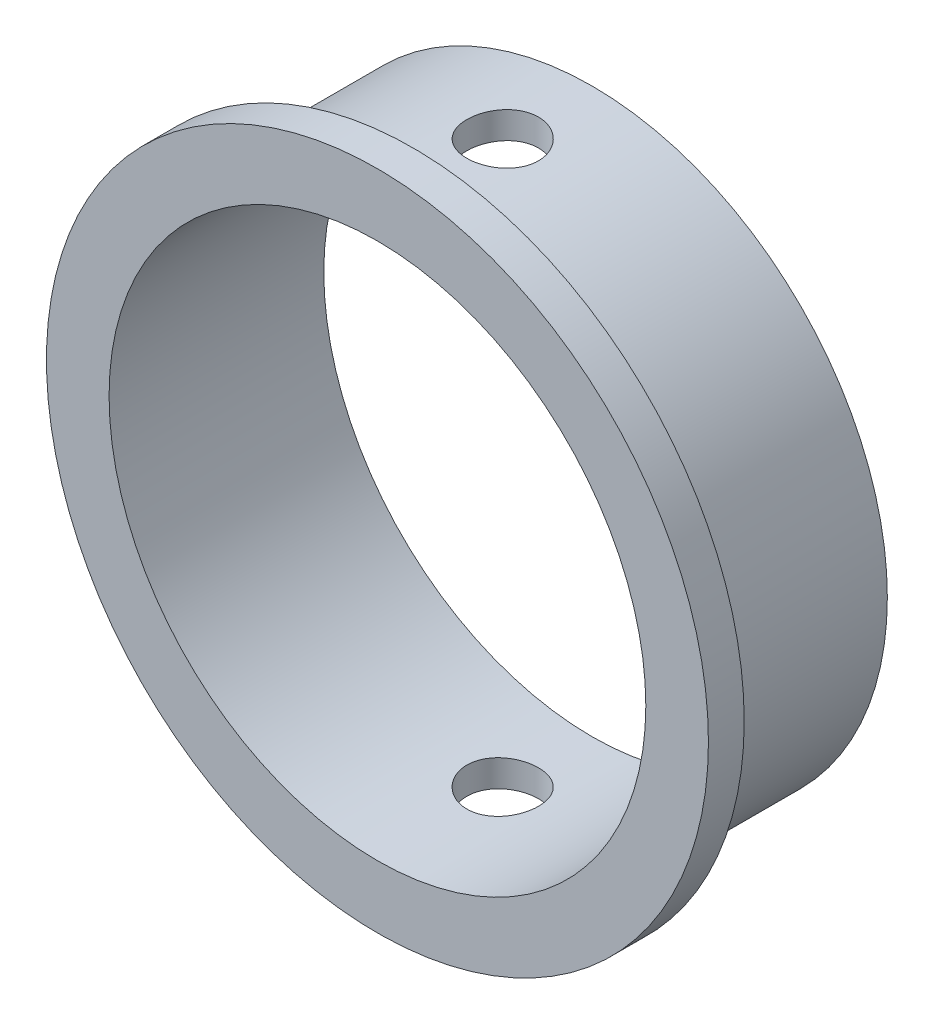
ISO-10303-21;
HEADER;
FILE_DESCRIPTION(('STEP AP214'),'2;1');
FILE_NAME('part.step','',(''),(''),'','','');
FILE_SCHEMA(('AUTOMOTIVE_DESIGN { 1 0 10303 214 1 1 1 1 }'));
ENDSEC;
DATA;
#1=APPLICATION_CONTEXT('core data for automotive mechanical design processes');
#2=APPLICATION_PROTOCOL_DEFINITION('international standard','automotive_design',2000,#1);
#3=PRODUCT_CONTEXT('',#1,'mechanical');
#4=PRODUCT('Part','Part','',(#3));
#5=PRODUCT_RELATED_PRODUCT_CATEGORY('part','',(#4));
#6=PRODUCT_DEFINITION_FORMATION('','',#4);
#7=PRODUCT_DEFINITION_CONTEXT('part definition',#1,'design');
#8=PRODUCT_DEFINITION('design','',#6,#7);
#9=PRODUCT_DEFINITION_SHAPE('','',#8);
#10=(LENGTH_UNIT() NAMED_UNIT(*) SI_UNIT(.MILLI.,.METRE.));
#11=(NAMED_UNIT(*) PLANE_ANGLE_UNIT() SI_UNIT($,.RADIAN.));
#12=(NAMED_UNIT(*) SI_UNIT($,.STERADIAN.) SOLID_ANGLE_UNIT());
#13=UNCERTAINTY_MEASURE_WITH_UNIT(LENGTH_MEASURE(1.E-05),#10,'distance_accuracy_value','');
#14=(GEOMETRIC_REPRESENTATION_CONTEXT(3) GLOBAL_UNCERTAINTY_ASSIGNED_CONTEXT((#13)) GLOBAL_UNIT_ASSIGNED_CONTEXT((#10,
#11,#12)) REPRESENTATION_CONTEXT('',''));
#15=CARTESIAN_POINT('',(0.,0.,0.));
#16=DIRECTION('',(0.,0.,1.));
#17=DIRECTION('',(1.,0.,0.));
#18=AXIS2_PLACEMENT_3D('',#15,#16,#17);
#19=CARTESIAN_POINT('',(0.,0.,12.));
#20=DIRECTION('',(0.,0.,-1.));
#21=DIRECTION('',(-1.,0.,0.));
#22=AXIS2_PLACEMENT_3D('',#19,#20,#21);
#23=CYLINDRICAL_SURFACE('',#22,16.5);
#24=CARTESIAN_POINT('',(0.,0.,0.));
#25=DIRECTION('',(0.,0.,1.));
#26=DIRECTION('',(1.,0.,0.));
#27=AXIS2_PLACEMENT_3D('',#24,#25,#26);
#28=CIRCLE('',#27,16.5);
#29=CARTESIAN_POINT('',(16.5,0.,0.));
#30=VERTEX_POINT('',#29);
#31=EDGE_CURVE('E51',#30,#30,#28,.T.);
#32=ORIENTED_EDGE('',*,*,#31,.T.);
#33=EDGE_LOOP('',(#32));
#34=FACE_BOUND('',#33,.T.);
#35=CARTESIAN_POINT('',(0.,0.,10.));
#36=DIRECTION('',(0.,0.,1.));
#37=DIRECTION('',(1.,0.,0.));
#38=AXIS2_PLACEMENT_3D('',#35,#36,#37);
#39=CIRCLE('',#38,16.5);
#40=CARTESIAN_POINT('',(16.5,0.,10.));
#41=VERTEX_POINT('',#40);
#42=EDGE_CURVE('E10',#41,#41,#39,.T.);
#43=ORIENTED_EDGE('',*,*,#42,.F.);
#44=EDGE_LOOP('',(#43));
#45=FACE_BOUND('',#44,.T.);
#46=CARTESIAN_POINT('',(0.,-16.5,3.));
#47=CARTESIAN_POINT('',(0.111900652745753,-16.4999984779065,3.00000477050452));
#48=CARTESIAN_POINT('',(0.223871904032017,-16.4988496240957,3.00942297400346));
#49=CARTESIAN_POINT('',(0.444700533689577,-16.4943771196932,3.04684643983153));
#50=CARTESIAN_POINT('',(0.553554504762757,-16.4910511775677,3.07487128736526));
#51=CARTESIAN_POINT('',(0.764919510268094,-16.4825993069214,3.1486718701649));
#52=CARTESIAN_POINT('',(0.867434690019245,-16.4774745697025,3.19443585927991));
#53=CARTESIAN_POINT('',(1.06330969859502,-16.4659955890597,3.30239042175111));
#54=CARTESIAN_POINT('',(1.15667113512243,-16.4596415621251,3.36457810344653));
#55=CARTESIAN_POINT('',(1.33209299868107,-16.4463769355912,3.50396004191844));
#56=CARTESIAN_POINT('',(1.41409908717695,-16.4394638947195,3.58122246201803));
#57=CARTESIAN_POINT('',(1.56401456556999,-16.4258801485878,3.74841444068733));
#58=CARTESIAN_POINT('',(1.63192324849505,-16.4192094554952,3.83834463415494));
#59=CARTESIAN_POINT('',(1.75191716988259,-16.4068415428533,4.02867056915003));
#60=CARTESIAN_POINT('',(1.80395175863557,-16.4011474641863,4.12909846523849));
#61=CARTESIAN_POINT('',(1.890396973409,-16.3914094269994,4.33734767326114));
#62=CARTESIAN_POINT('',(1.92480822874977,-16.3873654095577,4.4451687210337));
#63=CARTESIAN_POINT('',(1.97486543894206,-16.3814085259354,4.6645809803213));
#64=CARTESIAN_POINT('',(1.99060291820116,-16.3794852687384,4.77615102425448));
#65=CARTESIAN_POINT('',(2.00314900757413,-16.3779558032128,5.00036395290491));
#66=CARTESIAN_POINT('',(1.99995833501188,-16.378349507078,5.11300679680453));
#67=CARTESIAN_POINT('',(1.97481387160751,-16.3813999724305,5.33553111433497));
#68=CARTESIAN_POINT('',(1.95296075085867,-16.3840445916395,5.44542415339718));
#69=CARTESIAN_POINT('',(1.89126871983955,-16.3912799650409,5.65997160226844));
#70=CARTESIAN_POINT('',(1.85142946508204,-16.3958707565081,5.7646259116978));
#71=CARTESIAN_POINT('',(1.7547873702743,-16.4064950132083,5.96603876495957));
#72=CARTESIAN_POINT('',(1.69794063194365,-16.4125322036319,6.06277604097104));
#73=CARTESIAN_POINT('',(1.56892866589002,-16.4253661000015,6.24537581516183));
#74=CARTESIAN_POINT('',(1.49676277915695,-16.4321628386163,6.33123784524823));
#75=CARTESIAN_POINT('',(1.33860240327758,-16.4458040138629,6.49023425293448));
#76=CARTESIAN_POINT('',(1.25252111354027,-16.4526484734842,6.56328231212309));
#77=CARTESIAN_POINT('',(1.06927274722926,-16.4655725184432,6.6939056265894));
#78=CARTESIAN_POINT('',(0.972105647621771,-16.4716521021916,6.75148084971724));
#79=CARTESIAN_POINT('',(0.769378430470085,-16.4823648486936,6.84952362215943));
#80=CARTESIAN_POINT('',(0.663815756382462,-16.4869975687294,6.8899859365276));
#81=CARTESIAN_POINT('',(0.44732591244609,-16.4942905230712,6.95258666420573));
#82=CARTESIAN_POINT('',(0.336398978895798,-16.4969508441783,6.97472588388087));
#83=CARTESIAN_POINT('',(0.113075966743468,-16.4999879955856,6.99994048832598));
#84=CARTESIAN_POINT('',(0.000693503454519923,-16.5003790725291,7.00313481468463));
#85=CARTESIAN_POINT('',(-0.223005145792385,-16.4988720937279,6.99068259898083));
#86=CARTESIAN_POINT('',(-0.334321353028406,-16.4969740837604,6.97503643368959));
#87=CARTESIAN_POINT('',(-0.552377941153377,-16.4911111050895,6.92544616148108));
#88=CARTESIAN_POINT('',(-0.659131367635968,-16.48715252492,6.89155859866223));
#89=CARTESIAN_POINT('',(-0.865439758869918,-16.4776117375988,6.80650614932307));
#90=CARTESIAN_POINT('',(-0.964994492436562,-16.4720294783319,6.75534070822576));
#91=CARTESIAN_POINT('',(-1.15461179660808,-16.4598284940776,6.63689593947882));
#92=CARTESIAN_POINT('',(-1.24462586098187,-16.4532048615695,6.56953947269468));
#93=CARTESIAN_POINT('',(-1.41211356712873,-16.4396778886325,6.42073402837308));
#94=CARTESIAN_POINT('',(-1.48958674165607,-16.4327745377939,6.3392845259942));
#95=CARTESIAN_POINT('',(-1.63021400638046,-16.4194223992092,6.16408193573002));
#96=CARTESIAN_POINT('',(-1.69328937988266,-16.4129762372037,6.07026543637535));
#97=CARTESIAN_POINT('',(-1.80278720242417,-16.4013110252712,5.87330049527574));
#98=CARTESIAN_POINT('',(-1.84920996836413,-16.3960919519932,5.77015223116192));
#99=CARTESIAN_POINT('',(-1.9239566420472,-16.3874895132632,5.55770838322316));
#100=CARTESIAN_POINT('',(-1.95232533568764,-16.384101608491,5.44842874857452));
#101=CARTESIAN_POINT('',(-1.99030299852835,-16.3795319177777,5.22661333777482));
#102=CARTESIAN_POINT('',(-1.99991278426896,-16.3783500358125,5.11407770356775));
#103=CARTESIAN_POINT('',(-2.00008547152799,-16.3783288857002,4.88972774951011));
#104=CARTESIAN_POINT('',(-1.99077203440856,-16.3794744081966,4.77791350606227));
#105=CARTESIAN_POINT('',(-1.9536240895631,-16.38394634175,4.55745184452547));
#106=CARTESIAN_POINT('',(-1.92578957627467,-16.387272753462,4.44880442738761));
#107=CARTESIAN_POINT('',(-1.85242753726192,-16.3957270398671,4.23777429834076));
#108=CARTESIAN_POINT('',(-1.80690559263951,-16.400854346256,4.13538962206649));
#109=CARTESIAN_POINT('',(-1.69947310215269,-16.4123336803137,3.93969260079986));
#110=CARTESIAN_POINT('',(-1.63756239952019,-16.4186857196976,3.84638034260218));
#111=CARTESIAN_POINT('',(-1.49864990949873,-16.4319485568618,3.67084442679896));
#112=CARTESIAN_POINT('',(-1.42155592172374,-16.4388626087811,3.58869397437647));
#113=CARTESIAN_POINT('',(-1.2546566127553,-16.4524415074047,3.43844772589729));
#114=CARTESIAN_POINT('',(-1.16484829167884,-16.4591062948258,3.3703552560986));
#115=CARTESIAN_POINT('',(-0.974702654394307,-16.4714619027491,3.24995216293543));
#116=CARTESIAN_POINT('',(-0.874328764525234,-16.4771491478397,3.19769896209939));
#117=CARTESIAN_POINT('',(-0.666219372266618,-16.4868723231325,3.11086344762277));
#118=CARTESIAN_POINT('',(-0.558492066027745,-16.4909100579118,3.07626181266299));
#119=CARTESIAN_POINT('',(-0.375165330891701,-16.4958990645665,3.03405174026364));
#120=CARTESIAN_POINT('',(-0.300724781909804,-16.4974294768171,3.02130053806309));
#121=CARTESIAN_POINT('',(-0.150866849334733,-16.4994804542477,3.00427308840935));
#122=CARTESIAN_POINT('',(-0.0754494723712331,-16.5000010262778,2.99999678346783));
#123=CARTESIAN_POINT('',(0.,-16.5,3.));
#124=B_SPLINE_CURVE_WITH_KNOTS('',3,(#46,#47,#48,#49,#50,#51,#52,#53,#54,#55,#56,#57,#58,#59,
#60,#61,#62,#63,#64,#65,#66,#67,#68,#69,#70,#71,#72,#73,#74,#75,#76,#77,#78,#79,#80,#81,#82,#83,
#84,#85,#86,#87,#88,#89,#90,#91,#92,#93,#94,#95,#96,#97,#98,#99,#100,#101,#102,#103,#104,#105,
#106,#107,#108,#109,#110,#111,#112,#113,#114,#115,#116,#117,#118,#119,#120,#121,#122,#123),
.UNSPECIFIED.,.T.,.F.,(4,2,2,2,2,2,2,2,2,2,2,2,2,2,2,2,2,2,2,2,2,2,2,2,2,2,2,2,2,2,2,2,2,2,2,2,
2,2,4),(0.,0.335426378665762,0.671206385389908,1.00676443077977,1.34226343500719,
1.6793161714136,2.01638580662739,2.35451994966467,2.69264201726068,3.02909993522791,
3.3655451024651,3.70018677840282,4.03483486398249,4.37035427825133,4.70588812906054,
5.04360200462308,5.38131658189113,5.71913439357577,6.05693733773905,6.39261719196972,
6.72829033340282,7.0629289078826,7.39757822445073,7.7338546685743,8.07014363872965,
8.40822935978568,8.74630864669797,9.08354597302305,9.42076861970789,9.75579463865944,
10.0908207582288,10.4257412492092,10.7606649440165,11.0976889186223,11.4347925452798,
11.7731040558593,12.111044453397,12.3372085940178,12.5633712004793),.UNSPECIFIED.);
#125=CARTESIAN_POINT('',(0.,-16.5,3.));
#126=VERTEX_POINT('',#125);
#127=EDGE_CURVE('E88',#126,#126,#124,.T.);
#128=ORIENTED_EDGE('',*,*,#127,.F.);
#129=EDGE_LOOP('',(#128));
#130=FACE_BOUND('',#129,.T.);
#131=CARTESIAN_POINT('',(0.,16.5,3.));
#132=CARTESIAN_POINT('',(-0.111900652745753,16.4999984779065,3.00000477050452));
#133=CARTESIAN_POINT('',(-0.223871904032017,16.4988496240957,3.00942297400346));
#134=CARTESIAN_POINT('',(-0.444700533689577,16.4943771196932,3.04684643983153));
#135=CARTESIAN_POINT('',(-0.553554504762757,16.4910511775677,3.07487128736526));
#136=CARTESIAN_POINT('',(-0.764919510268094,16.4825993069214,3.1486718701649));
#137=CARTESIAN_POINT('',(-0.867434690019245,16.4774745697025,3.19443585927991));
#138=CARTESIAN_POINT('',(-1.06330969859502,16.4659955890597,3.30239042175111));
#139=CARTESIAN_POINT('',(-1.15667113512243,16.4596415621251,3.36457810344653));
#140=CARTESIAN_POINT('',(-1.33209299868107,16.4463769355912,3.50396004191844));
#141=CARTESIAN_POINT('',(-1.41409908717695,16.4394638947195,3.58122246201803));
#142=CARTESIAN_POINT('',(-1.56401456556999,16.4258801485878,3.74841444068733));
#143=CARTESIAN_POINT('',(-1.63192324849505,16.4192094554952,3.83834463415494));
#144=CARTESIAN_POINT('',(-1.75191716988259,16.4068415428533,4.02867056915003));
#145=CARTESIAN_POINT('',(-1.80395175863557,16.4011474641863,4.12909846523849));
#146=CARTESIAN_POINT('',(-1.890396973409,16.3914094269994,4.33734767326114));
#147=CARTESIAN_POINT('',(-1.92480822874977,16.3873654095577,4.4451687210337));
#148=CARTESIAN_POINT('',(-1.97486543894206,16.3814085259354,4.6645809803213));
#149=CARTESIAN_POINT('',(-1.99060291820116,16.3794852687384,4.77615102425448));
#150=CARTESIAN_POINT('',(-2.00314900757413,16.3779558032128,5.00036395290491));
#151=CARTESIAN_POINT('',(-1.99995833501188,16.378349507078,5.11300679680453));
#152=CARTESIAN_POINT('',(-1.97481387160751,16.3813999724305,5.33553111433497));
#153=CARTESIAN_POINT('',(-1.95296075085867,16.3840445916395,5.44542415339718));
#154=CARTESIAN_POINT('',(-1.89126871983955,16.3912799650409,5.65997160226844));
#155=CARTESIAN_POINT('',(-1.85142946508204,16.3958707565081,5.7646259116978));
#156=CARTESIAN_POINT('',(-1.7547873702743,16.4064950132083,5.96603876495957));
#157=CARTESIAN_POINT('',(-1.69794063194365,16.4125322036319,6.06277604097104));
#158=CARTESIAN_POINT('',(-1.56892866589002,16.4253661000015,6.24537581516183));
#159=CARTESIAN_POINT('',(-1.49676277915695,16.4321628386163,6.33123784524823));
#160=CARTESIAN_POINT('',(-1.33860240327758,16.4458040138629,6.49023425293448));
#161=CARTESIAN_POINT('',(-1.25252111354027,16.4526484734842,6.56328231212309));
#162=CARTESIAN_POINT('',(-1.06927274722926,16.4655725184432,6.6939056265894));
#163=CARTESIAN_POINT('',(-0.972105647621771,16.4716521021916,6.75148084971724));
#164=CARTESIAN_POINT('',(-0.769378430470085,16.4823648486936,6.84952362215943));
#165=CARTESIAN_POINT('',(-0.663815756382462,16.4869975687294,6.8899859365276));
#166=CARTESIAN_POINT('',(-0.44732591244609,16.4942905230712,6.95258666420573));
#167=CARTESIAN_POINT('',(-0.336398978895798,16.4969508441783,6.97472588388087));
#168=CARTESIAN_POINT('',(-0.113075966743468,16.4999879955856,6.99994048832598));
#169=CARTESIAN_POINT('',(-0.000693503454519923,16.5003790725291,7.00313481468463));
#170=CARTESIAN_POINT('',(0.223005145792385,16.4988720937279,6.99068259898083));
#171=CARTESIAN_POINT('',(0.334321353028406,16.4969740837604,6.97503643368959));
#172=CARTESIAN_POINT('',(0.552377941153377,16.4911111050895,6.92544616148108));
#173=CARTESIAN_POINT('',(0.659131367635968,16.48715252492,6.89155859866223));
#174=CARTESIAN_POINT('',(0.865439758869918,16.4776117375988,6.80650614932307));
#175=CARTESIAN_POINT('',(0.964994492436562,16.4720294783319,6.75534070822576));
#176=CARTESIAN_POINT('',(1.15461179660808,16.4598284940776,6.63689593947882));
#177=CARTESIAN_POINT('',(1.24462586098187,16.4532048615695,6.56953947269468));
#178=CARTESIAN_POINT('',(1.41211356712873,16.4396778886325,6.42073402837308));
#179=CARTESIAN_POINT('',(1.48958674165607,16.4327745377939,6.3392845259942));
#180=CARTESIAN_POINT('',(1.63021400638046,16.4194223992092,6.16408193573002));
#181=CARTESIAN_POINT('',(1.69328937988266,16.4129762372037,6.07026543637535));
#182=CARTESIAN_POINT('',(1.80278720242417,16.4013110252712,5.87330049527574));
#183=CARTESIAN_POINT('',(1.84920996836413,16.3960919519932,5.77015223116192));
#184=CARTESIAN_POINT('',(1.9239566420472,16.3874895132632,5.55770838322316));
#185=CARTESIAN_POINT('',(1.95232533568764,16.384101608491,5.44842874857452));
#186=CARTESIAN_POINT('',(1.99030299852835,16.3795319177777,5.22661333777482));
#187=CARTESIAN_POINT('',(1.99991278426896,16.3783500358125,5.11407770356775));
#188=CARTESIAN_POINT('',(2.00008547152799,16.3783288857002,4.88972774951011));
#189=CARTESIAN_POINT('',(1.99077203440856,16.3794744081966,4.77791350606227));
#190=CARTESIAN_POINT('',(1.9536240895631,16.38394634175,4.55745184452547));
#191=CARTESIAN_POINT('',(1.92578957627467,16.387272753462,4.44880442738761));
#192=CARTESIAN_POINT('',(1.85242753726192,16.3957270398671,4.23777429834076));
#193=CARTESIAN_POINT('',(1.80690559263951,16.400854346256,4.13538962206649));
#194=CARTESIAN_POINT('',(1.69947310215269,16.4123336803137,3.93969260079986));
#195=CARTESIAN_POINT('',(1.63756239952019,16.4186857196976,3.84638034260218));
#196=CARTESIAN_POINT('',(1.49864990949873,16.4319485568618,3.67084442679896));
#197=CARTESIAN_POINT('',(1.42155592172374,16.4388626087811,3.58869397437647));
#198=CARTESIAN_POINT('',(1.2546566127553,16.4524415074047,3.43844772589729));
#199=CARTESIAN_POINT('',(1.16484829167884,16.4591062948258,3.3703552560986));
#200=CARTESIAN_POINT('',(0.974702654394307,16.4714619027491,3.24995216293543));
#201=CARTESIAN_POINT('',(0.874328764525234,16.4771491478397,3.19769896209939));
#202=CARTESIAN_POINT('',(0.666219372266618,16.4868723231325,3.11086344762277));
#203=CARTESIAN_POINT('',(0.558492066027745,16.4909100579118,3.07626181266299));
#204=CARTESIAN_POINT('',(0.375165330891701,16.4958990645665,3.03405174026364));
#205=CARTESIAN_POINT('',(0.300724781909804,16.4974294768171,3.02130053806309));
#206=CARTESIAN_POINT('',(0.150866849334733,16.4994804542477,3.00427308840935));
#207=CARTESIAN_POINT('',(0.0754494723712331,16.5000010262778,2.99999678346783));
#208=CARTESIAN_POINT('',(0.,16.5,3.));
#209=B_SPLINE_CURVE_WITH_KNOTS('',3,(#131,#132,#133,#134,#135,#136,#137,#138,#139,#140,#141,
#142,#143,#144,#145,#146,#147,#148,#149,#150,#151,#152,#153,#154,#155,#156,#157,#158,#159,#160,
#161,#162,#163,#164,#165,#166,#167,#168,#169,#170,#171,#172,#173,#174,#175,#176,#177,#178,#179,
#180,#181,#182,#183,#184,#185,#186,#187,#188,#189,#190,#191,#192,#193,#194,#195,#196,#197,#198,
#199,#200,#201,#202,#203,#204,#205,#206,#207,#208),.UNSPECIFIED.,.T.,.F.,(4,2,2,2,2,2,2,2,2,2,2,
2,2,2,2,2,2,2,2,2,2,2,2,2,2,2,2,2,2,2,2,2,2,2,2,2,2,2,4),(0.,0.335426378665762,
0.671206385389908,1.00676443077977,1.34226343500719,1.6793161714136,2.01638580662739,
2.35451994966467,2.69264201726068,3.02909993522791,3.3655451024651,3.70018677840282,
4.03483486398249,4.37035427825133,4.70588812906054,5.04360200462308,5.38131658189113,
5.71913439357577,6.05693733773905,6.39261719196972,6.72829033340282,7.0629289078826,
7.39757822445073,7.7338546685743,8.07014363872965,8.40822935978568,8.74630864669797,
9.08354597302305,9.42076861970789,9.75579463865944,10.0908207582288,10.4257412492092,
10.7606649440165,11.0976889186223,11.4347925452798,11.7731040558593,12.111044453397,
12.3372085940178,12.5633712004793),.UNSPECIFIED.);
#210=CARTESIAN_POINT('',(0.,16.5,3.));
#211=VERTEX_POINT('',#210);
#212=EDGE_CURVE('E94',#211,#211,#209,.T.);
#213=ORIENTED_EDGE('',*,*,#212,.F.);
#214=EDGE_LOOP('',(#213));
#215=FACE_BOUND('',#214,.T.);
#216=ADVANCED_FACE('F37',(#34,#45,#130,#215),#23,.T.);
#217=CARTESIAN_POINT('',(0.,0.,12.));
#218=DIRECTION('',(0.,0.,-1.));
#219=DIRECTION('',(-1.,0.,0.));
#220=AXIS2_PLACEMENT_3D('',#217,#218,#219);
#221=CYLINDRICAL_SURFACE('',#220,15.);
#222=CARTESIAN_POINT('',(0.,-15.,3.));
#223=CARTESIAN_POINT('',(0.111808835669284,-14.9999983574254,3.00000470970691));
#224=CARTESIAN_POINT('',(0.22368597927628,-14.9987367072719,3.00940753796247));
#225=CARTESIAN_POINT('',(0.444322725138079,-14.993825111269,3.04676634904956));
#226=CARTESIAN_POINT('',(0.553079022333037,-14.9901727244172,3.07474129489715));
#227=CARTESIAN_POINT('',(0.764248312626984,-14.9808907984907,3.14840171754145));
#228=CARTESIAN_POINT('',(0.866665683058493,-14.9752626421097,3.19407481103844));
#229=CARTESIAN_POINT('',(1.0623638950303,-14.9626538666039,3.30180691380628));
#230=CARTESIAN_POINT('',(1.15564620633702,-14.9556734655857,3.36386328116646));
#231=CARTESIAN_POINT('',(1.33102582250468,-14.9410899478996,3.50301326160418));
#232=CARTESIAN_POINT('',(1.41305798549586,-14.9334835816211,3.58018864500847));
#233=CARTESIAN_POINT('',(1.56304735673102,-14.9185313755795,3.74721018907665));
#234=CARTESIAN_POINT('',(1.63100381997221,-14.9111855496234,3.83705701999581));
#235=CARTESIAN_POINT('',(1.75115902268907,-14.8975543544019,4.02729912294503));
#236=CARTESIAN_POINT('',(1.80329607482578,-14.8912731776576,4.12773368247862));
#237=CARTESIAN_POINT('',(1.8899384500729,-14.8805258737923,4.33603106723679));
#238=CARTESIAN_POINT('',(1.92444453245278,-14.8760596685121,4.44389357235331));
#239=CARTESIAN_POINT('',(1.97464606772174,-14.8694793656867,4.66330581050166));
#240=CARTESIAN_POINT('',(1.99045204228506,-14.8673514537014,4.77482983453292));
#241=CARTESIAN_POINT('',(2.00314680548117,-14.8656465160931,4.99896617960595));
#242=CARTESIAN_POINT('',(2.00003645633601,-14.866069374204,5.1115784508109));
#243=CARTESIAN_POINT('',(1.97507745939234,-14.8694055577299,5.33392113002793));
#244=CARTESIAN_POINT('',(1.95335097531762,-14.8723026462234,5.4436655298857));
#245=CARTESIAN_POINT('',(1.89196724634371,-14.8802355277475,5.65793683676009));
#246=CARTESIAN_POINT('',(1.85230959261457,-14.8852713695413,5.76246362475501));
#247=CARTESIAN_POINT('',(1.75605929143191,-14.8969326111103,5.9637096347072));
#248=CARTESIAN_POINT('',(1.69941397913749,-14.903562941239,6.06040337119431));
#249=CARTESIAN_POINT('',(1.57083393344289,-14.9176623621993,6.24295908191766));
#250=CARTESIAN_POINT('',(1.49889840502385,-14.9251314966353,6.32882049255417));
#251=CARTESIAN_POINT('',(1.34110490026362,-14.9401389923359,6.4879830125819));
#252=CARTESIAN_POINT('',(1.25514170702645,-14.947677435412,6.56117984270233));
#253=CARTESIAN_POINT('',(1.07209417013341,-14.9619192381826,6.69212204492839));
#254=CARTESIAN_POINT('',(0.97500979444237,-14.9686225954715,6.74986737252352));
#255=CARTESIAN_POINT('',(0.77239221973047,-14.9804439374358,6.84826911769474));
#256=CARTESIAN_POINT('',(0.666855578841231,-14.9855612720896,6.88891853104631));
#257=CARTESIAN_POINT('',(0.45037092433625,-14.9936282590407,6.95188931897234));
#258=CARTESIAN_POINT('',(0.339423199542258,-14.9965780268993,6.97421167063939));
#259=CARTESIAN_POINT('',(0.116166903325644,-14.9999624137686,6.99975843277112));
#260=CARTESIAN_POINT('',(0.00387503454704284,-15.0004159384905,7.00312640178349));
#261=CARTESIAN_POINT('',(-0.219671617218717,-14.9988079153852,6.99104833587282));
#262=CARTESIAN_POINT('',(-0.330926425345664,-14.996746428686,6.97560275821764));
#263=CARTESIAN_POINT('',(-0.548813715572938,-14.990351753581,6.92645534661602));
#264=CARTESIAN_POINT('',(-0.655462016512045,-14.9860271430292,6.89282243167785));
#265=CARTESIAN_POINT('',(-0.86160509879356,-14.9755900925429,6.80832703406291));
#266=CARTESIAN_POINT('',(-0.961099607015637,-14.9694775843944,6.75746389398675));
#267=CARTESIAN_POINT('',(-1.15074887861608,-14.9560983737007,6.63960784441669));
#268=CARTESIAN_POINT('',(-1.2408458143966,-14.9488251504572,6.57252263428667));
#269=CARTESIAN_POINT('',(-1.4085529469919,-14.9339572870998,6.42425667077575));
#270=CARTESIAN_POINT('',(-1.48616257662378,-14.9263626324062,6.34307527748357));
#271=CARTESIAN_POINT('',(-1.62720549423098,-14.9116490247351,6.16828685736045));
#272=CARTESIAN_POINT('',(-1.69054327608938,-14.904533487753,6.07460243326184));
#273=CARTESIAN_POINT('',(-1.80058351078814,-14.8916413300182,5.87784058971907));
#274=CARTESIAN_POINT('',(-1.84728633510346,-14.8858646793678,5.77476338008962));
#275=CARTESIAN_POINT('',(-1.92257836500746,-14.8763281178008,5.56244275797231));
#276=CARTESIAN_POINT('',(-1.95122028846795,-14.872562342326,5.4532183147892));
#277=CARTESIAN_POINT('',(-1.98974667143959,-14.8674574869829,5.23145636787124));
#278=CARTESIAN_POINT('',(-1.99963213426782,-14.8661182773134,5.11891904167557));
#279=CARTESIAN_POINT('',(-2.00034485806189,-14.8660223129545,4.89467650914649));
#280=CARTESIAN_POINT('',(-1.99132219194493,-14.8672452228252,4.78297175903576));
#281=CARTESIAN_POINT('',(-1.95479376686689,-14.872091838742,4.56268212489613));
#282=CARTESIAN_POINT('',(-1.92728801483269,-14.8757155438883,4.45409723969802));
#283=CARTESIAN_POINT('',(-1.85462310332207,-14.8849489027276,4.24315631674841));
#284=CARTESIAN_POINT('',(-1.80947220819041,-14.890557626594,4.14079738888314));
#285=CARTESIAN_POINT('',(-1.70281342759737,-14.9031304571282,3.94508411617394));
#286=CARTESIAN_POINT('',(-1.64130522630429,-14.910094589966,3.85172994524396));
#287=CARTESIAN_POINT('',(-1.50312448509508,-14.9246596718306,3.67591035007159));
#288=CARTESIAN_POINT('',(-1.42634027226901,-14.9322650575408,3.59353305224487));
#289=CARTESIAN_POINT('',(-1.26002169349824,-14.9472171900166,3.44277678363846));
#290=CARTESIAN_POINT('',(-1.17048434072978,-14.9545638756898,3.37440110124975));
#291=CARTESIAN_POINT('',(-0.980752987852823,-14.9682063513753,3.25333286153348));
#292=CARTESIAN_POINT('',(-0.880514620743967,-14.9744974642689,3.20070933344476));
#293=CARTESIAN_POINT('',(-0.672592409587331,-14.9852732065897,3.11311940145492));
#294=CARTESIAN_POINT('',(-0.564916678969891,-14.9897597692431,3.07813409137514));
#295=CARTESIAN_POINT('',(-0.380588408098419,-14.9953572174327,3.03505199361482));
#296=CARTESIAN_POINT('',(-0.305091081955779,-14.9970896363507,3.02192675647636));
#297=CARTESIAN_POINT('',(-0.153073171616112,-14.9994115849077,3.00439918583453));
#298=CARTESIAN_POINT('',(-0.0765525964512404,-15.000001124628,2.9999967753864));
#299=CARTESIAN_POINT('',(0.,-15.,3.));
#300=B_SPLINE_CURVE_WITH_KNOTS('',3,(#222,#223,#224,#225,#226,#227,#228,#229,#230,#231,#232,
#233,#234,#235,#236,#237,#238,#239,#240,#241,#242,#243,#244,#245,#246,#247,#248,#249,#250,#251,
#252,#253,#254,#255,#256,#257,#258,#259,#260,#261,#262,#263,#264,#265,#266,#267,#268,#269,#270,
#271,#272,#273,#274,#275,#276,#277,#278,#279,#280,#281,#282,#283,#284,#285,#286,#287,#288,#289,
#290,#291,#292,#293,#294,#295,#296,#297,#298,#299),.UNSPECIFIED.,.T.,.F.,(4,2,2,2,2,2,2,2,2,2,2,
2,2,2,2,2,2,2,2,2,2,2,2,2,2,2,2,2,2,2,2,2,2,2,2,2,2,2,4),(0.,0.335146851305743,
0.670636430885044,1.0058916928274,1.34109292564034,1.67815978443559,2.01524447904836,
2.35362721511647,2.69199537766204,3.02835355914359,3.3646964092492,3.69884885098043,
4.0330089117585,4.36821583137897,4.70344018443797,5.04130544484849,5.37917167852296,
5.71717620202538,6.05516270391743,6.39058584992061,6.72600084354478,7.06015363396463,
7.39431917503546,7.73043274769884,8.06656158258761,8.4048770453545,8.74318495273048,
9.08050074735454,9.41779849783634,9.75242927496624,10.0870599266875,10.4215340370262,
10.756014605959,11.0930366783511,11.4301378125116,11.7686952667452,12.1068890499242,
12.3363573904731,12.5658237068544),.UNSPECIFIED.);
#301=CARTESIAN_POINT('',(0.,-15.,3.));
#302=VERTEX_POINT('',#301);
#303=EDGE_CURVE('E66',#302,#302,#300,.T.);
#304=ORIENTED_EDGE('',*,*,#303,.T.);
#305=EDGE_LOOP('',(#304));
#306=FACE_BOUND('',#305,.T.);
#307=CARTESIAN_POINT('',(0.,0.,0.));
#308=DIRECTION('',(0.,0.,1.));
#309=DIRECTION('',(1.,0.,0.));
#310=AXIS2_PLACEMENT_3D('',#307,#308,#309);
#311=CIRCLE('',#310,15.);
#312=CARTESIAN_POINT('',(15.,0.,0.));
#313=VERTEX_POINT('',#312);
#314=EDGE_CURVE('E57',#313,#313,#311,.T.);
#315=ORIENTED_EDGE('',*,*,#314,.F.);
#316=EDGE_LOOP('',(#315));
#317=FACE_BOUND('',#316,.T.);
#318=CARTESIAN_POINT('',(0.,0.,12.));
#319=DIRECTION('',(0.,0.,-1.));
#320=DIRECTION('',(-1.,0.,0.));
#321=AXIS2_PLACEMENT_3D('',#318,#319,#320);
#322=CIRCLE('',#321,15.);
#323=CARTESIAN_POINT('',(-15.,0.,12.));
#324=VERTEX_POINT('',#323);
#325=EDGE_CURVE('E101',#324,#324,#322,.T.);
#326=ORIENTED_EDGE('',*,*,#325,.F.);
#327=EDGE_LOOP('',(#326));
#328=FACE_BOUND('',#327,.T.);
#329=CARTESIAN_POINT('',(0.,15.,3.));
#330=CARTESIAN_POINT('',(-0.111808835669284,14.9999983574254,3.00000470970691));
#331=CARTESIAN_POINT('',(-0.22368597927628,14.9987367072719,3.00940753796247));
#332=CARTESIAN_POINT('',(-0.444322725138079,14.993825111269,3.04676634904956));
#333=CARTESIAN_POINT('',(-0.553079022333037,14.9901727244172,3.07474129489715));
#334=CARTESIAN_POINT('',(-0.764248312626984,14.9808907984907,3.14840171754145));
#335=CARTESIAN_POINT('',(-0.866665683058493,14.9752626421097,3.19407481103844));
#336=CARTESIAN_POINT('',(-1.0623638950303,14.9626538666039,3.30180691380628));
#337=CARTESIAN_POINT('',(-1.15564620633702,14.9556734655857,3.36386328116646));
#338=CARTESIAN_POINT('',(-1.33102582250468,14.9410899478996,3.50301326160418));
#339=CARTESIAN_POINT('',(-1.41305798549586,14.9334835816211,3.58018864500847));
#340=CARTESIAN_POINT('',(-1.56304735673102,14.9185313755795,3.74721018907665));
#341=CARTESIAN_POINT('',(-1.63100381997221,14.9111855496234,3.83705701999581));
#342=CARTESIAN_POINT('',(-1.75115902268907,14.8975543544019,4.02729912294503));
#343=CARTESIAN_POINT('',(-1.80329607482578,14.8912731776576,4.12773368247862));
#344=CARTESIAN_POINT('',(-1.8899384500729,14.8805258737923,4.33603106723679));
#345=CARTESIAN_POINT('',(-1.92444453245278,14.8760596685121,4.44389357235331));
#346=CARTESIAN_POINT('',(-1.97464606772174,14.8694793656867,4.66330581050166));
#347=CARTESIAN_POINT('',(-1.99045204228506,14.8673514537014,4.77482983453292));
#348=CARTESIAN_POINT('',(-2.00314680548117,14.8656465160931,4.99896617960595));
#349=CARTESIAN_POINT('',(-2.00003645633601,14.866069374204,5.1115784508109));
#350=CARTESIAN_POINT('',(-1.97507745939234,14.8694055577299,5.33392113002793));
#351=CARTESIAN_POINT('',(-1.95335097531762,14.8723026462234,5.4436655298857));
#352=CARTESIAN_POINT('',(-1.89196724634371,14.8802355277475,5.65793683676009));
#353=CARTESIAN_POINT('',(-1.85230959261457,14.8852713695413,5.76246362475501));
#354=CARTESIAN_POINT('',(-1.75605929143191,14.8969326111103,5.9637096347072));
#355=CARTESIAN_POINT('',(-1.69941397913749,14.903562941239,6.06040337119431));
#356=CARTESIAN_POINT('',(-1.57083393344289,14.9176623621993,6.24295908191766));
#357=CARTESIAN_POINT('',(-1.49889840502385,14.9251314966353,6.32882049255417));
#358=CARTESIAN_POINT('',(-1.34110490026362,14.9401389923359,6.4879830125819));
#359=CARTESIAN_POINT('',(-1.25514170702645,14.947677435412,6.56117984270233));
#360=CARTESIAN_POINT('',(-1.07209417013341,14.9619192381826,6.69212204492839));
#361=CARTESIAN_POINT('',(-0.97500979444237,14.9686225954715,6.74986737252352));
#362=CARTESIAN_POINT('',(-0.77239221973047,14.9804439374358,6.84826911769474));
#363=CARTESIAN_POINT('',(-0.666855578841231,14.9855612720896,6.88891853104631));
#364=CARTESIAN_POINT('',(-0.45037092433625,14.9936282590407,6.95188931897234));
#365=CARTESIAN_POINT('',(-0.339423199542258,14.9965780268993,6.97421167063939));
#366=CARTESIAN_POINT('',(-0.116166903325644,14.9999624137686,6.99975843277112));
#367=CARTESIAN_POINT('',(-0.00387503454704284,15.0004159384905,7.00312640178349));
#368=CARTESIAN_POINT('',(0.219671617218717,14.9988079153852,6.99104833587282));
#369=CARTESIAN_POINT('',(0.330926425345664,14.996746428686,6.97560275821764));
#370=CARTESIAN_POINT('',(0.548813715572938,14.990351753581,6.92645534661602));
#371=CARTESIAN_POINT('',(0.655462016512045,14.9860271430292,6.89282243167785));
#372=CARTESIAN_POINT('',(0.86160509879356,14.9755900925429,6.80832703406291));
#373=CARTESIAN_POINT('',(0.961099607015637,14.9694775843944,6.75746389398675));
#374=CARTESIAN_POINT('',(1.15074887861608,14.9560983737007,6.63960784441669));
#375=CARTESIAN_POINT('',(1.2408458143966,14.9488251504572,6.57252263428667));
#376=CARTESIAN_POINT('',(1.4085529469919,14.9339572870998,6.42425667077575));
#377=CARTESIAN_POINT('',(1.48616257662378,14.9263626324062,6.34307527748357));
#378=CARTESIAN_POINT('',(1.62720549423098,14.9116490247351,6.16828685736045));
#379=CARTESIAN_POINT('',(1.69054327608938,14.904533487753,6.07460243326184));
#380=CARTESIAN_POINT('',(1.80058351078814,14.8916413300182,5.87784058971907));
#381=CARTESIAN_POINT('',(1.84728633510346,14.8858646793678,5.77476338008962));
#382=CARTESIAN_POINT('',(1.92257836500746,14.8763281178008,5.56244275797231));
#383=CARTESIAN_POINT('',(1.95122028846795,14.872562342326,5.4532183147892));
#384=CARTESIAN_POINT('',(1.98974667143959,14.8674574869829,5.23145636787124));
#385=CARTESIAN_POINT('',(1.99963213426782,14.8661182773134,5.11891904167557));
#386=CARTESIAN_POINT('',(2.00034485806189,14.8660223129545,4.89467650914649));
#387=CARTESIAN_POINT('',(1.99132219194493,14.8672452228252,4.78297175903576));
#388=CARTESIAN_POINT('',(1.95479376686689,14.872091838742,4.56268212489613));
#389=CARTESIAN_POINT('',(1.92728801483269,14.8757155438883,4.45409723969802));
#390=CARTESIAN_POINT('',(1.85462310332207,14.8849489027276,4.24315631674841));
#391=CARTESIAN_POINT('',(1.80947220819041,14.890557626594,4.14079738888314));
#392=CARTESIAN_POINT('',(1.70281342759737,14.9031304571282,3.94508411617394));
#393=CARTESIAN_POINT('',(1.64130522630429,14.910094589966,3.85172994524396));
#394=CARTESIAN_POINT('',(1.50312448509508,14.9246596718306,3.67591035007159));
#395=CARTESIAN_POINT('',(1.42634027226901,14.9322650575408,3.59353305224487));
#396=CARTESIAN_POINT('',(1.26002169349824,14.9472171900166,3.44277678363846));
#397=CARTESIAN_POINT('',(1.17048434072978,14.9545638756898,3.37440110124975));
#398=CARTESIAN_POINT('',(0.980752987852823,14.9682063513753,3.25333286153348));
#399=CARTESIAN_POINT('',(0.880514620743967,14.9744974642689,3.20070933344476));
#400=CARTESIAN_POINT('',(0.672592409587331,14.9852732065897,3.11311940145492));
#401=CARTESIAN_POINT('',(0.564916678969891,14.9897597692431,3.07813409137514));
#402=CARTESIAN_POINT('',(0.380588408098419,14.9953572174327,3.03505199361482));
#403=CARTESIAN_POINT('',(0.305091081955779,14.9970896363507,3.02192675647636));
#404=CARTESIAN_POINT('',(0.153073171616112,14.9994115849077,3.00439918583453));
#405=CARTESIAN_POINT('',(0.0765525964512404,15.000001124628,2.9999967753864));
#406=CARTESIAN_POINT('',(0.,15.,3.));
#407=B_SPLINE_CURVE_WITH_KNOTS('',3,(#329,#330,#331,#332,#333,#334,#335,#336,#337,#338,#339,
#340,#341,#342,#343,#344,#345,#346,#347,#348,#349,#350,#351,#352,#353,#354,#355,#356,#357,#358,
#359,#360,#361,#362,#363,#364,#365,#366,#367,#368,#369,#370,#371,#372,#373,#374,#375,#376,#377,
#378,#379,#380,#381,#382,#383,#384,#385,#386,#387,#388,#389,#390,#391,#392,#393,#394,#395,#396,
#397,#398,#399,#400,#401,#402,#403,#404,#405,#406),.UNSPECIFIED.,.T.,.F.,(4,2,2,2,2,2,2,2,2,2,2,
2,2,2,2,2,2,2,2,2,2,2,2,2,2,2,2,2,2,2,2,2,2,2,2,2,2,2,4),(0.,0.335146851305743,
0.670636430885044,1.0058916928274,1.34109292564034,1.67815978443559,2.01524447904836,
2.35362721511647,2.69199537766204,3.02835355914359,3.3646964092492,3.69884885098043,
4.0330089117585,4.36821583137897,4.70344018443797,5.04130544484849,5.37917167852296,
5.71717620202538,6.05516270391743,6.39058584992061,6.72600084354478,7.06015363396463,
7.39431917503546,7.73043274769884,8.06656158258761,8.4048770453545,8.74318495273048,
9.08050074735454,9.41779849783634,9.75242927496624,10.0870599266875,10.4215340370262,
10.756014605959,11.0930366783511,11.4301378125116,11.7686952667452,12.1068890499242,
12.3363573904731,12.5658237068544),.UNSPECIFIED.);
#408=CARTESIAN_POINT('',(0.,15.,3.));
#409=VERTEX_POINT('',#408);
#410=EDGE_CURVE('E41',#409,#409,#407,.T.);
#411=ORIENTED_EDGE('',*,*,#410,.T.);
#412=EDGE_LOOP('',(#411));
#413=FACE_BOUND('',#412,.T.);
#414=ADVANCED_FACE('F72',(#306,#317,#328,#413),#221,.F.);
#415=CARTESIAN_POINT('',(0.,0.,0.));
#416=DIRECTION('',(0.,0.,1.));
#417=DIRECTION('',(1.,0.,0.));
#418=AXIS2_PLACEMENT_3D('',#415,#416,#417);
#419=PLANE('',#418);
#420=ORIENTED_EDGE('',*,*,#31,.F.);
#421=EDGE_LOOP('',(#420));
#422=FACE_BOUND('',#421,.T.);
#423=ORIENTED_EDGE('',*,*,#314,.T.);
#424=EDGE_LOOP('',(#423));
#425=FACE_BOUND('',#424,.T.);
#426=ADVANCED_FACE('F116',(#422,#425),#419,.F.);
#427=CARTESIAN_POINT('',(0.,0.,10.));
#428=DIRECTION('',(0.,0.,1.));
#429=DIRECTION('',(1.,0.,0.));
#430=AXIS2_PLACEMENT_3D('',#427,#428,#429);
#431=CYLINDRICAL_SURFACE('',#430,18.5);
#432=CARTESIAN_POINT('',(0.,0.,10.));
#433=DIRECTION('',(0.,0.,1.));
#434=DIRECTION('',(1.,0.,0.));
#435=AXIS2_PLACEMENT_3D('',#432,#433,#434);
#436=CIRCLE('',#435,18.5);
#437=CARTESIAN_POINT('',(18.5,0.,10.));
#438=VERTEX_POINT('',#437);
#439=EDGE_CURVE('E65',#438,#438,#436,.T.);
#440=ORIENTED_EDGE('',*,*,#439,.T.);
#441=EDGE_LOOP('',(#440));
#442=FACE_BOUND('',#441,.T.);
#443=CARTESIAN_POINT('',(0.,0.,12.));
#444=DIRECTION('',(0.,0.,1.));
#445=DIRECTION('',(1.,0.,0.));
#446=AXIS2_PLACEMENT_3D('',#443,#444,#445);
#447=CIRCLE('',#446,18.5);
#448=CARTESIAN_POINT('',(18.5,0.,12.));
#449=VERTEX_POINT('',#448);
#450=EDGE_CURVE('E61',#449,#449,#447,.T.);
#451=ORIENTED_EDGE('',*,*,#450,.F.);
#452=EDGE_LOOP('',(#451));
#453=FACE_BOUND('',#452,.T.);
#454=ADVANCED_FACE('F114',(#442,#453),#431,.T.);
#455=CARTESIAN_POINT('',(0.,0.,10.));
#456=DIRECTION('',(0.,0.,1.));
#457=DIRECTION('',(1.,0.,0.));
#458=AXIS2_PLACEMENT_3D('',#455,#456,#457);
#459=PLANE('',#458);
#460=ORIENTED_EDGE('',*,*,#42,.T.);
#461=EDGE_LOOP('',(#460));
#462=FACE_BOUND('',#461,.T.);
#463=ORIENTED_EDGE('',*,*,#439,.F.);
#464=EDGE_LOOP('',(#463));
#465=FACE_BOUND('',#464,.T.);
#466=ADVANCED_FACE('F82',(#462,#465),#459,.F.);
#467=CARTESIAN_POINT('',(0.,0.,12.));
#468=DIRECTION('',(0.,0.,1.));
#469=DIRECTION('',(1.,0.,0.));
#470=AXIS2_PLACEMENT_3D('',#467,#468,#469);
#471=PLANE('',#470);
#472=ORIENTED_EDGE('',*,*,#325,.T.);
#473=EDGE_LOOP('',(#472));
#474=FACE_BOUND('',#473,.T.);
#475=ORIENTED_EDGE('',*,*,#450,.T.);
#476=EDGE_LOOP('',(#475));
#477=FACE_BOUND('',#476,.T.);
#478=ADVANCED_FACE('F112',(#474,#477),#471,.T.);
#479=CARTESIAN_POINT('',(0.,22.,5.));
#480=DIRECTION('',(0.,-1.,0.));
#481=DIRECTION('',(0.,0.,-1.));
#482=AXIS2_PLACEMENT_3D('',#479,#480,#481);
#483=CYLINDRICAL_SURFACE('',#482,2.);
#484=ORIENTED_EDGE('',*,*,#303,.F.);
#485=EDGE_LOOP('',(#484));
#486=FACE_BOUND('',#485,.T.);
#487=ORIENTED_EDGE('',*,*,#127,.T.);
#488=EDGE_LOOP('',(#487));
#489=FACE_BOUND('',#488,.T.);
#490=ADVANCED_FACE('F80',(#486,#489),#483,.F.);
#491=ORIENTED_EDGE('',*,*,#410,.F.);
#492=EDGE_LOOP('',(#491));
#493=FACE_BOUND('',#492,.T.);
#494=ORIENTED_EDGE('',*,*,#212,.T.);
#495=EDGE_LOOP('',(#494));
#496=FACE_BOUND('',#495,.T.);
#497=ADVANCED_FACE('F76',(#493,#496),#483,.F.);
#498=CLOSED_SHELL('',(#216,#414,#426,#454,#466,#478,#490,#497));
#499=MANIFOLD_SOLID_BREP('B2',#498);
#500=ADVANCED_BREP_SHAPE_REPRESENTATION('',(#18,#499),#14);
#501=SHAPE_DEFINITION_REPRESENTATION(#9,#500);
ENDSEC;
END-ISO-10303-21;
